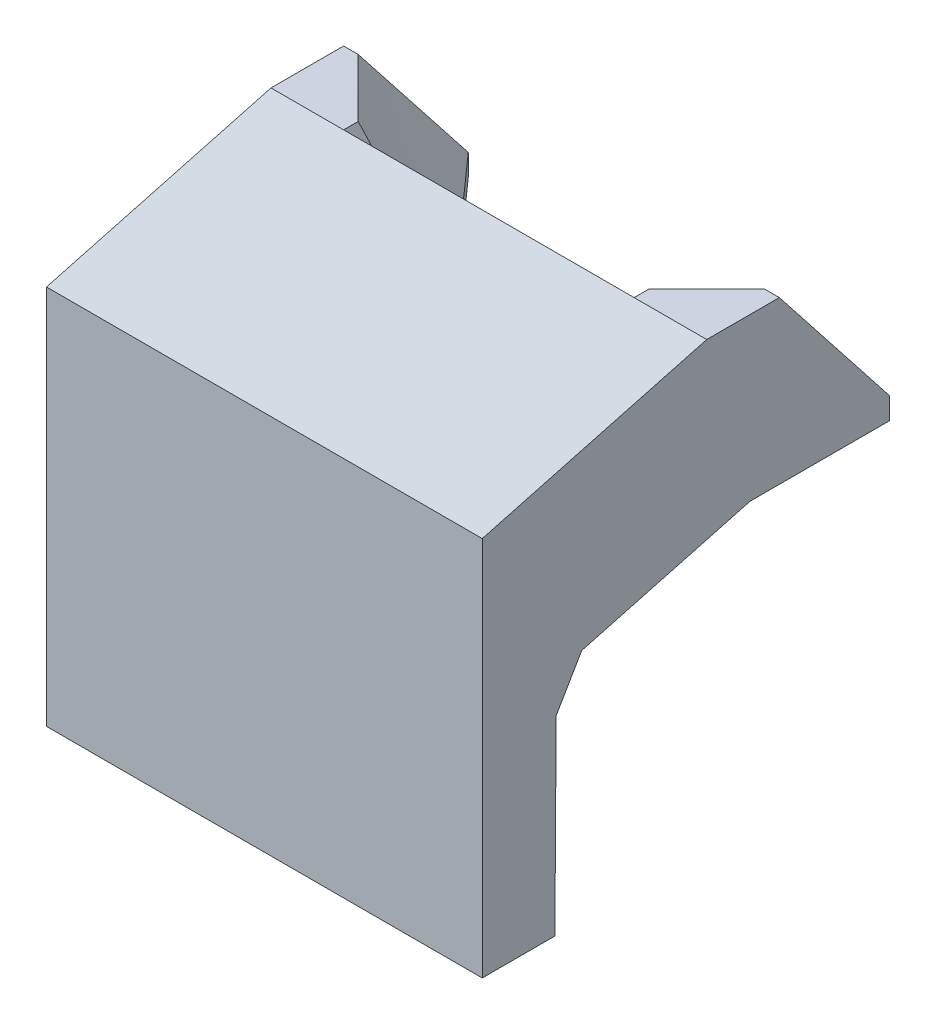
ISO-10303-21;
HEADER;
FILE_DESCRIPTION(('STEP AP214'),'2;1');
FILE_NAME('part.step','',(''),(''),'','','');
FILE_SCHEMA(('AUTOMOTIVE_DESIGN { 1 0 10303 214 1 1 1 1 }'));
ENDSEC;
DATA;
#1=APPLICATION_CONTEXT('core data for automotive mechanical design processes');
#2=APPLICATION_PROTOCOL_DEFINITION('international standard','automotive_design',2000,#1);
#3=PRODUCT_CONTEXT('',#1,'mechanical');
#4=PRODUCT('Part','Part','',(#3));
#5=PRODUCT_RELATED_PRODUCT_CATEGORY('part','',(#4));
#6=PRODUCT_DEFINITION_FORMATION('','',#4);
#7=PRODUCT_DEFINITION_CONTEXT('part definition',#1,'design');
#8=PRODUCT_DEFINITION('design','',#6,#7);
#9=PRODUCT_DEFINITION_SHAPE('','',#8);
#10=(LENGTH_UNIT() NAMED_UNIT(*) SI_UNIT(.MILLI.,.METRE.));
#11=(NAMED_UNIT(*) PLANE_ANGLE_UNIT() SI_UNIT($,.RADIAN.));
#12=(NAMED_UNIT(*) SI_UNIT($,.STERADIAN.) SOLID_ANGLE_UNIT());
#13=UNCERTAINTY_MEASURE_WITH_UNIT(LENGTH_MEASURE(1.E-05),#10,'distance_accuracy_value','');
#14=(GEOMETRIC_REPRESENTATION_CONTEXT(3) GLOBAL_UNCERTAINTY_ASSIGNED_CONTEXT((#13)) GLOBAL_UNIT_ASSIGNED_CONTEXT((#10,
#11,#12)) REPRESENTATION_CONTEXT('',''));
#15=CARTESIAN_POINT('',(0.,0.,0.));
#16=DIRECTION('',(0.,0.,1.));
#17=DIRECTION('',(1.,0.,0.));
#18=AXIS2_PLACEMENT_3D('',#15,#16,#17);
#19=CARTESIAN_POINT('',(762.,487.820479131947,-341.339964862952));
#20=DIRECTION('',(0.,-0.258819045102518,0.965925826289069));
#21=DIRECTION('',(0.,-0.965925826289069,-0.258819045102518));
#22=AXIS2_PLACEMENT_3D('',#19,#20,#21);
#23=PLANE('',#22);
#24=DIRECTION('',(0.,-0.965925826289069,-0.258819045102518));
#25=VECTOR('',#24,1.);
#26=CARTESIAN_POINT('',(228.6,487.820479131947,-341.339964862952));
#27=LINE('',#26,#25);
#28=CARTESIAN_POINT('',(228.6,525.920479131947,-331.131100631326));
#29=VERTEX_POINT('',#28);
#30=CARTESIAN_POINT('',(228.6,487.820479131947,-341.339964862952));
#31=VERTEX_POINT('',#30);
#32=EDGE_CURVE('E79',#29,#31,#27,.T.);
#33=ORIENTED_EDGE('',*,*,#32,.F.);
#34=DIRECTION('',(0.372177239238478,-0.896535336836941,-0.24022591949142));
#35=VECTOR('',#34,1.);
#36=CARTESIAN_POINT('',(127.,770.664059929663,-265.552255803878));
#37=LINE('',#36,#35);
#38=CARTESIAN_POINT('',(127.,770.664059929663,-265.552255803878));
#39=VERTEX_POINT('',#38);
#40=EDGE_CURVE('E891',#39,#29,#37,.T.);
#41=ORIENTED_EDGE('',*,*,#40,.F.);
#42=DIRECTION('',(-1.,0.,0.));
#43=VECTOR('',#42,1.);
#44=CARTESIAN_POINT('',(762.,770.664059929663,-265.552255803878));
#45=LINE('',#44,#43);
#46=CARTESIAN_POINT('',(635.,770.664059929663,-265.552255803878));
#47=VERTEX_POINT('',#46);
#48=EDGE_CURVE('E524',#47,#39,#45,.T.);
#49=ORIENTED_EDGE('',*,*,#48,.F.);
#50=DIRECTION('',(-0.372177239238478,-0.896535336836941,-0.24022591949142));
#51=VECTOR('',#50,1.);
#52=CARTESIAN_POINT('',(635.,770.664059929663,-265.552255803878));
#53=LINE('',#52,#51);
#54=CARTESIAN_POINT('',(533.4,525.920479131947,-331.131100631326));
#55=VERTEX_POINT('',#54);
#56=EDGE_CURVE('E577',#47,#55,#53,.T.);
#57=ORIENTED_EDGE('',*,*,#56,.T.);
#58=DIRECTION('',(0.,-0.965925826289069,-0.258819045102518));
#59=VECTOR('',#58,1.);
#60=CARTESIAN_POINT('',(533.4,487.820479131947,-341.339964862952));
#61=LINE('',#60,#59);
#62=CARTESIAN_POINT('',(533.4,487.820479131947,-341.339964862951));
#63=VERTEX_POINT('',#62);
#64=EDGE_CURVE('E523',#55,#63,#61,.T.);
#65=ORIENTED_EDGE('',*,*,#64,.T.);
#66=DIRECTION('',(-1.,0.,0.));
#67=VECTOR('',#66,1.);
#68=CARTESIAN_POINT('',(762.,487.820479131947,-341.339964862952));
#69=LINE('',#68,#67);
#70=EDGE_CURVE('E714',#63,#31,#69,.T.);
#71=ORIENTED_EDGE('',*,*,#70,.T.);
#72=EDGE_LOOP('',(#33,#41,#49,#57,#65,#71));
#73=FACE_BOUND('',#72,.T.);
#74=ADVANCED_FACE('F54',(#73),#23,.F.);
#75=CARTESIAN_POINT('',(762.,332.7324341847,-2.2438452541043));
#76=DIRECTION('',(0.,0.505828707352784,0.862633942537512));
#77=DIRECTION('',(0.,-0.862633942537512,0.505828707352784));
#78=AXIS2_PLACEMENT_3D('',#75,#76,#77);
#79=PLANE('',#78);
#80=DIRECTION('',(0.,0.862633942537512,-0.505828707352784));
#81=VECTOR('',#80,1.);
#82=CARTESIAN_POINT('',(0.,332.7324341847,-2.2438452541043));
#83=LINE('',#82,#81);
#84=CARTESIAN_POINT('',(0.,332.7324341847,-2.2438452541043));
#85=VERTEX_POINT('',#84);
#86=CARTESIAN_POINT('',(0.,408.9324341847,-46.9257730100435));
#87=VERTEX_POINT('',#86);
#88=EDGE_CURVE('E602',#85,#87,#83,.T.);
#89=ORIENTED_EDGE('',*,*,#88,.T.);
#90=DIRECTION('',(-1.,0.,0.));
#91=VECTOR('',#90,1.);
#92=CARTESIAN_POINT('',(762.,408.9324341847,-46.9257730100435));
#93=LINE('',#92,#91);
#94=CARTESIAN_POINT('',(762.,408.9324341847,-46.9257730100435));
#95=VERTEX_POINT('',#94);
#96=EDGE_CURVE('E12',#95,#87,#93,.T.);
#97=ORIENTED_EDGE('',*,*,#96,.F.);
#98=DIRECTION('',(0.,0.862633942537512,-0.505828707352784));
#99=VECTOR('',#98,1.);
#100=CARTESIAN_POINT('',(762.,332.7324341847,-2.2438452541043));
#101=LINE('',#100,#99);
#102=CARTESIAN_POINT('',(762.,332.7324341847,-2.2438452541043));
#103=VERTEX_POINT('',#102);
#104=EDGE_CURVE('E689',#103,#95,#101,.T.);
#105=ORIENTED_EDGE('',*,*,#104,.F.);
#106=DIRECTION('',(-1.,0.,0.));
#107=VECTOR('',#106,1.);
#108=CARTESIAN_POINT('',(762.,332.7324341847,-2.2438452541043));
#109=LINE('',#108,#107);
#110=EDGE_CURVE('E679',#103,#85,#109,.T.);
#111=ORIENTED_EDGE('',*,*,#110,.T.);
#112=EDGE_LOOP('',(#89,#97,#105,#111));
#113=FACE_BOUND('',#112,.T.);
#114=ADVANCED_FACE('F56',(#113),#79,.F.);
#115=CARTESIAN_POINT('',(762.,408.9324341847,-46.9257730100435));
#116=DIRECTION('',(0.,0.965925826289069,0.258819045102518));
#117=DIRECTION('',(0.,-0.258819045102518,0.965925826289069));
#118=AXIS2_PLACEMENT_3D('',#115,#116,#117);
#119=PLANE('',#118);
#120=DIRECTION('',(0.,0.258819045102518,-0.965925826289069));
#121=VECTOR('',#120,1.);
#122=CARTESIAN_POINT('',(0.,408.9324341847,-46.9257730100435));
#123=LINE('',#122,#121);
#124=CARTESIAN_POINT('',(0.,487.820479131947,-341.339964862952));
#125=VERTEX_POINT('',#124);
#126=EDGE_CURVE('E605',#87,#125,#123,.T.);
#127=ORIENTED_EDGE('',*,*,#126,.T.);
#128=DIRECTION('',(-1.,0.,0.));
#129=VECTOR('',#128,1.);
#130=CARTESIAN_POINT('',(762.,487.820479131947,-341.339964862951));
#131=LINE('',#130,#129);
#132=EDGE_CURVE('E72',#31,#125,#131,.T.);
#133=ORIENTED_EDGE('',*,*,#132,.F.);
#134=ORIENTED_EDGE('',*,*,#70,.F.);
#135=CARTESIAN_POINT('',(762.,487.820479131947,-341.339964862952));
#136=VERTEX_POINT('',#135);
#137=EDGE_CURVE('E64',#136,#63,#69,.T.);
#138=ORIENTED_EDGE('',*,*,#137,.F.);
#139=DIRECTION('',(0.,0.258819045102518,-0.965925826289069));
#140=VECTOR('',#139,1.);
#141=CARTESIAN_POINT('',(762.,408.9324341847,-46.9257730100435));
#142=LINE('',#141,#140);
#143=EDGE_CURVE('E519',#95,#136,#142,.T.);
#144=ORIENTED_EDGE('',*,*,#143,.F.);
#145=ORIENTED_EDGE('',*,*,#96,.T.);
#146=EDGE_LOOP('',(#127,#133,#134,#138,#144,#145));
#147=FACE_BOUND('',#146,.T.);
#148=ADVANCED_FACE('F320',(#147),#119,.F.);
#149=CARTESIAN_POINT('',(762.,770.664059929663,-265.552255803878));
#150=DIRECTION('',(0.,-0.965925826289069,-0.258819045102518));
#151=DIRECTION('',(0.,0.258819045102518,-0.965925826289069));
#152=AXIS2_PLACEMENT_3D('',#149,#150,#151);
#153=PLANE('',#152);
#154=DIRECTION('',(0.,-0.258819045102518,0.965925826289069));
#155=VECTOR('',#154,1.);
#156=CARTESIAN_POINT('',(0.,770.664059929663,-265.552255803878));
#157=LINE('',#156,#155);
#158=CARTESIAN_POINT('',(0.,770.664059929663,-265.552255803878));
#159=VERTEX_POINT('',#158);
#160=CARTESIAN_POINT('',(0.,665.48,127.));
#161=VERTEX_POINT('',#160);
#162=EDGE_CURVE('E614',#159,#161,#157,.T.);
#163=ORIENTED_EDGE('',*,*,#162,.T.);
#164=DIRECTION('',(-1.,0.,0.));
#165=VECTOR('',#164,1.);
#166=CARTESIAN_POINT('',(762.,665.48,127.));
#167=LINE('',#166,#165);
#168=CARTESIAN_POINT('',(762.,665.48,127.));
#169=VERTEX_POINT('',#168);
#170=EDGE_CURVE('E710',#169,#161,#167,.T.);
#171=ORIENTED_EDGE('',*,*,#170,.F.);
#172=DIRECTION('',(0.,-0.258819045102518,0.965925826289069));
#173=VECTOR('',#172,1.);
#174=CARTESIAN_POINT('',(762.,770.664059929663,-265.552255803878));
#175=LINE('',#174,#173);
#176=CARTESIAN_POINT('',(762.,770.664059929663,-265.552255803878));
#177=VERTEX_POINT('',#176);
#178=EDGE_CURVE('E516',#177,#169,#175,.T.);
#179=ORIENTED_EDGE('',*,*,#178,.F.);
#180=CARTESIAN_POINT('',(762.,770.664059929663,-265.552255803878));
#181=DIRECTION('',(-1.,0.,0.));
#182=VECTOR('',#181,1.);
#183=LINE('',#180,#182);
#184=EDGE_CURVE('E716',#177,#47,#183,.T.);
#185=ORIENTED_EDGE('',*,*,#184,.T.);
#186=ORIENTED_EDGE('',*,*,#48,.T.);
#187=DIRECTION('',(-1.,0.,0.));
#188=VECTOR('',#187,1.);
#189=CARTESIAN_POINT('',(127.,770.664059929663,-265.552255803878));
#190=LINE('',#189,#188);
#191=EDGE_CURVE('E218',#39,#159,#190,.T.);
#192=ORIENTED_EDGE('',*,*,#191,.T.);
#193=EDGE_LOOP('',(#163,#171,#179,#185,#186,#192));
#194=FACE_BOUND('',#193,.T.);
#195=ADVANCED_FACE('F309',(#194),#153,.F.);
#196=CARTESIAN_POINT('',(762.,665.48,127.));
#197=DIRECTION('',(0.,0.,-1.));
#198=DIRECTION('',(-1.,0.,0.));
#199=AXIS2_PLACEMENT_3D('',#196,#197,#198);
#200=PLANE('',#199);
#201=DIRECTION('',(0.,-1.,0.));
#202=VECTOR('',#201,1.);
#203=CARTESIAN_POINT('',(0.,665.48,127.));
#204=LINE('',#203,#202);
#205=CARTESIAN_POINT('',(0.,0.,127.));
#206=VERTEX_POINT('',#205);
#207=EDGE_CURVE('E700',#161,#206,#204,.T.);
#208=ORIENTED_EDGE('',*,*,#207,.T.);
#209=DIRECTION('',(-1.,0.,0.));
#210=VECTOR('',#209,1.);
#211=CARTESIAN_POINT('',(762.,0.,127.));
#212=LINE('',#211,#210);
#213=CARTESIAN_POINT('',(762.,0.,127.));
#214=VERTEX_POINT('',#213);
#215=EDGE_CURVE('E707',#214,#206,#212,.T.);
#216=ORIENTED_EDGE('',*,*,#215,.F.);
#217=DIRECTION('',(0.,-1.,0.));
#218=VECTOR('',#217,1.);
#219=CARTESIAN_POINT('',(762.,665.48,127.));
#220=LINE('',#219,#218);
#221=EDGE_CURVE('E518',#169,#214,#220,.T.);
#222=ORIENTED_EDGE('',*,*,#221,.F.);
#223=ORIENTED_EDGE('',*,*,#170,.T.);
#224=EDGE_LOOP('',(#208,#216,#222,#223));
#225=FACE_BOUND('',#224,.T.);
#226=ADVANCED_FACE('F319',(#225),#200,.F.);
#227=CARTESIAN_POINT('',(762.,0.,127.));
#228=DIRECTION('',(0.,1.,0.));
#229=DIRECTION('',(0.,0.,1.));
#230=AXIS2_PLACEMENT_3D('',#227,#228,#229);
#231=PLANE('',#230);
#232=DIRECTION('',(0.,0.,-1.));
#233=VECTOR('',#232,1.);
#234=CARTESIAN_POINT('',(0.,0.,127.));
#235=LINE('',#234,#233);
#236=CARTESIAN_POINT('',(0.,0.,0.));
#237=VERTEX_POINT('',#236);
#238=EDGE_CURVE('E693',#206,#237,#235,.T.);
#239=ORIENTED_EDGE('',*,*,#238,.T.);
#240=DIRECTION('',(-1.,0.,0.));
#241=VECTOR('',#240,1.);
#242=CARTESIAN_POINT('',(762.,0.,0.));
#243=LINE('',#242,#241);
#244=CARTESIAN_POINT('',(762.,0.,0.));
#245=VERTEX_POINT('',#244);
#246=EDGE_CURVE('E704',#245,#237,#243,.T.);
#247=ORIENTED_EDGE('',*,*,#246,.F.);
#248=DIRECTION('',(0.,0.,-1.));
#249=VECTOR('',#248,1.);
#250=CARTESIAN_POINT('',(762.,0.,127.));
#251=LINE('',#250,#249);
#252=EDGE_CURVE('E697',#214,#245,#251,.T.);
#253=ORIENTED_EDGE('',*,*,#252,.F.);
#254=ORIENTED_EDGE('',*,*,#215,.T.);
#255=EDGE_LOOP('',(#239,#247,#253,#254));
#256=FACE_BOUND('',#255,.T.);
#257=ADVANCED_FACE('F724',(#256),#231,.F.);
#258=CARTESIAN_POINT('',(762.,0.,0.));
#259=DIRECTION('',(0.,0.00674353926219962,0.999977262080603));
#260=DIRECTION('',(0.,-0.999977262080603,0.00674353926219962));
#261=AXIS2_PLACEMENT_3D('',#258,#259,#260);
#262=PLANE('',#261);
#263=DIRECTION('',(0.,0.999977262080603,-0.00674353926219962));
#264=VECTOR('',#263,1.);
#265=CARTESIAN_POINT('',(0.,0.,0.));
#266=LINE('',#265,#264);
#267=EDGE_CURVE('E683',#237,#85,#266,.T.);
#268=ORIENTED_EDGE('',*,*,#267,.T.);
#269=ORIENTED_EDGE('',*,*,#110,.F.);
#270=DIRECTION('',(0.,0.999977262080603,-0.00674353926219962));
#271=VECTOR('',#270,1.);
#272=CARTESIAN_POINT('',(762.,0.,0.));
#273=LINE('',#272,#271);
#274=EDGE_CURVE('E692',#245,#103,#273,.T.);
#275=ORIENTED_EDGE('',*,*,#274,.F.);
#276=ORIENTED_EDGE('',*,*,#246,.T.);
#277=EDGE_LOOP('',(#268,#269,#275,#276));
#278=FACE_BOUND('',#277,.T.);
#279=ADVANCED_FACE('F359',(#278),#262,.F.);
#280=CARTESIAN_POINT('',(762.,0.,0.));
#281=DIRECTION('',(-1.,0.,0.));
#282=DIRECTION('',(0.,0.,1.));
#283=AXIS2_PLACEMENT_3D('',#280,#281,#282);
#284=PLANE('',#283);
#285=ORIENTED_EDGE('',*,*,#143,.T.);
#286=DIRECTION('',(0.,0.,-1.));
#287=VECTOR('',#286,1.);
#288=CARTESIAN_POINT('',(762.,487.820479131947,-331.131100631326));
#289=LINE('',#288,#287);
#290=CARTESIAN_POINT('',(762.,487.820479131947,-585.131100631326));
#291=VERTEX_POINT('',#290);
#292=EDGE_CURVE('E429',#136,#291,#289,.T.);
#293=ORIENTED_EDGE('',*,*,#292,.T.);
#294=DIRECTION('',(0.,1.,0.));
#295=VECTOR('',#294,1.);
#296=CARTESIAN_POINT('',(762.,487.820479131947,-585.131100631326));
#297=LINE('',#296,#295);
#298=CARTESIAN_POINT('',(762.,525.920479131947,-585.131100631326));
#299=VERTEX_POINT('',#298);
#300=EDGE_CURVE('E440',#291,#299,#297,.T.);
#301=ORIENTED_EDGE('',*,*,#300,.T.);
#302=DIRECTION('',(0.,-0.785880865119772,-0.618377931235097));
#303=VECTOR('',#302,1.);
#304=CARTESIAN_POINT('',(762.,770.664059929663,-392.552255803878));
#305=LINE('',#304,#303);
#306=CARTESIAN_POINT('',(762.,770.664059929663,-392.552255803878));
#307=VERTEX_POINT('',#306);
#308=EDGE_CURVE('E512',#307,#299,#305,.T.);
#309=ORIENTED_EDGE('',*,*,#308,.F.);
#310=DIRECTION('',(0.,0.,-1.));
#311=VECTOR('',#310,1.);
#312=CARTESIAN_POINT('',(762.,770.664059929663,-265.552255803878));
#313=LINE('',#312,#311);
#314=EDGE_CURVE('E340',#177,#307,#313,.T.);
#315=ORIENTED_EDGE('',*,*,#314,.F.);
#316=ORIENTED_EDGE('',*,*,#178,.T.);
#317=ORIENTED_EDGE('',*,*,#221,.T.);
#318=ORIENTED_EDGE('',*,*,#252,.T.);
#319=ORIENTED_EDGE('',*,*,#274,.T.);
#320=ORIENTED_EDGE('',*,*,#104,.T.);
#321=EDGE_LOOP('',(#285,#293,#301,#309,#315,#316,#317,#318,#319,#320));
#322=FACE_BOUND('',#321,.T.);
#323=ADVANCED_FACE('F348',(#322),#284,.F.);
#324=CARTESIAN_POINT('',(0.,0.,0.));
#325=DIRECTION('',(-1.,0.,0.));
#326=DIRECTION('',(0.,0.,1.));
#327=AXIS2_PLACEMENT_3D('',#324,#325,#326);
#328=PLANE('',#327);
#329=DIRECTION('',(0.,0.,-1.));
#330=VECTOR('',#329,1.);
#331=CARTESIAN_POINT('',(0.,487.820479131947,-331.131100631326));
#332=LINE('',#331,#330);
#333=CARTESIAN_POINT('',(0.,487.820479131947,-585.131100631326));
#334=VERTEX_POINT('',#333);
#335=EDGE_CURVE('E210',#125,#334,#332,.T.);
#336=ORIENTED_EDGE('',*,*,#335,.F.);
#337=ORIENTED_EDGE('',*,*,#126,.F.);
#338=ORIENTED_EDGE('',*,*,#88,.F.);
#339=ORIENTED_EDGE('',*,*,#267,.F.);
#340=ORIENTED_EDGE('',*,*,#238,.F.);
#341=ORIENTED_EDGE('',*,*,#207,.F.);
#342=ORIENTED_EDGE('',*,*,#162,.F.);
#343=DIRECTION('',(0.,0.,-1.));
#344=VECTOR('',#343,1.);
#345=CARTESIAN_POINT('',(0.,770.664059929663,-265.552255803878));
#346=LINE('',#345,#344);
#347=CARTESIAN_POINT('',(0.,770.664059929663,-392.552255803878));
#348=VERTEX_POINT('',#347);
#349=EDGE_CURVE('E295',#159,#348,#346,.T.);
#350=ORIENTED_EDGE('',*,*,#349,.T.);
#351=DIRECTION('',(0.,-0.785880865119772,-0.618377931235097));
#352=VECTOR('',#351,1.);
#353=CARTESIAN_POINT('',(0.,770.664059929663,-392.552255803878));
#354=LINE('',#353,#352);
#355=CARTESIAN_POINT('',(0.,525.920479131947,-585.131100631326));
#356=VERTEX_POINT('',#355);
#357=EDGE_CURVE('E293',#348,#356,#354,.T.);
#358=ORIENTED_EDGE('',*,*,#357,.T.);
#359=DIRECTION('',(0.,1.,0.));
#360=VECTOR('',#359,1.);
#361=CARTESIAN_POINT('',(0.,487.820479131947,-585.131100631326));
#362=LINE('',#361,#360);
#363=EDGE_CURVE('E416',#334,#356,#362,.T.);
#364=ORIENTED_EDGE('',*,*,#363,.F.);
#365=EDGE_LOOP('',(#336,#337,#338,#339,#340,#341,#342,#350,#358,#364));
#366=FACE_BOUND('',#365,.T.);
#367=ADVANCED_FACE('F358',(#366),#328,.T.);
#368=CARTESIAN_POINT('',(0.,770.664059929663,0.));
#369=DIRECTION('',(0.,1.,0.));
#370=DIRECTION('',(0.,0.,1.));
#371=AXIS2_PLACEMENT_3D('',#368,#369,#370);
#372=PLANE('',#371);
#373=ORIENTED_EDGE('',*,*,#184,.F.);
#374=ORIENTED_EDGE('',*,*,#314,.T.);
#375=DIRECTION('',(-1.,0.,0.));
#376=VECTOR('',#375,1.);
#377=CARTESIAN_POINT('',(762.,770.664059929663,-392.552255803878));
#378=LINE('',#377,#376);
#379=CARTESIAN_POINT('',(736.6,770.664059929663,-392.552255803878));
#380=VERTEX_POINT('',#379);
#381=EDGE_CURVE('E522',#307,#380,#378,.T.);
#382=ORIENTED_EDGE('',*,*,#381,.T.);
#383=DIRECTION('',(-0.707106781186547,0.,0.707106781186547));
#384=VECTOR('',#383,1.);
#385=CARTESIAN_POINT('',(736.6,770.664059929663,-392.552255803878));
#386=LINE('',#385,#384);
#387=CARTESIAN_POINT('',(635.,770.664059929663,-290.952255803878));
#388=VERTEX_POINT('',#387);
#389=EDGE_CURVE('E513',#380,#388,#386,.T.);
#390=ORIENTED_EDGE('',*,*,#389,.T.);
#391=DIRECTION('',(0.,0.,1.));
#392=VECTOR('',#391,1.);
#393=CARTESIAN_POINT('',(635.,770.664059929663,-290.952255803878));
#394=LINE('',#393,#392);
#395=EDGE_CURVE('E446',#388,#47,#394,.T.);
#396=ORIENTED_EDGE('',*,*,#395,.T.);
#397=EDGE_LOOP('',(#373,#374,#382,#390,#396));
#398=FACE_BOUND('',#397,.T.);
#399=ADVANCED_FACE('F368',(#398),#372,.T.);
#400=CARTESIAN_POINT('',(2.69672465141973E-12,485.46436828936,-616.964381270939));
#401=DIRECTION('',(0.,0.618377931235097,-0.785880865119772));
#402=DIRECTION('',(0.,0.785880865119772,0.618377931235097));
#403=AXIS2_PLACEMENT_3D('',#400,#401,#402);
#404=PLANE('',#403);
#405=ORIENTED_EDGE('',*,*,#308,.T.);
#406=DIRECTION('',(-1.,0.,0.));
#407=VECTOR('',#406,1.);
#408=CARTESIAN_POINT('',(762.,525.920479131947,-585.131100631326));
#409=LINE('',#408,#407);
#410=CARTESIAN_POINT('',(736.6,525.920479131947,-585.131100631326));
#411=VERTEX_POINT('',#410);
#412=EDGE_CURVE('E498',#299,#411,#409,.T.);
#413=ORIENTED_EDGE('',*,*,#412,.T.);
#414=DIRECTION('',(0.,-0.785880865119772,-0.618377931235098));
#415=VECTOR('',#414,1.);
#416=CARTESIAN_POINT('',(736.6,648.292269530805,-488.841678217602));
#417=LINE('',#416,#415);
#418=EDGE_CURVE('E571',#380,#411,#417,.T.);
#419=ORIENTED_EDGE('',*,*,#418,.F.);
#420=ORIENTED_EDGE('',*,*,#381,.F.);
#421=EDGE_LOOP('',(#405,#413,#419,#420));
#422=FACE_BOUND('',#421,.T.);
#423=ADVANCED_FACE('F462',(#422),#404,.T.);
#424=CARTESIAN_POINT('',(268.759717863551,-111.569779464433,0.));
#425=DIRECTION('',(-0.923580539340854,0.383404469654252,0.));
#426=DIRECTION('',(-0.383404469654252,-0.923580539340854,0.));
#427=AXIS2_PLACEMENT_3D('',#424,#425,#426);
#428=PLANE('',#427);
#429=DIRECTION('',(-0.372177239238478,-0.896535336836941,-0.24022591949142));
#430=VECTOR('',#429,1.);
#431=CARTESIAN_POINT('',(635.,770.664059929663,-290.952255803878));
#432=LINE('',#431,#430);
#433=CARTESIAN_POINT('',(533.4,525.920479131947,-356.531100631326));
#434=VERTEX_POINT('',#433);
#435=EDGE_CURVE('E451',#388,#434,#432,.T.);
#436=ORIENTED_EDGE('',*,*,#435,.T.);
#437=DIRECTION('',(0.,0.,1.));
#438=VECTOR('',#437,1.);
#439=CARTESIAN_POINT('',(533.4,525.920479131947,-356.531100631326));
#440=LINE('',#439,#438);
#441=EDGE_CURVE('E598',#434,#55,#440,.T.);
#442=ORIENTED_EDGE('',*,*,#441,.T.);
#443=ORIENTED_EDGE('',*,*,#56,.F.);
#444=ORIENTED_EDGE('',*,*,#395,.F.);
#445=EDGE_LOOP('',(#436,#442,#443,#444));
#446=FACE_BOUND('',#445,.T.);
#447=ADVANCED_FACE('F453',(#446),#428,.T.);
#448=CARTESIAN_POINT('',(635.,770.664059929663,-290.952255803878));
#449=CARTESIAN_POINT('',(533.4,525.920479131947,-356.531100631326));
#450=CARTESIAN_POINT('',(651.933333333333,770.664059929663,-307.885589137211));
#451=CARTESIAN_POINT('',(567.266666666666,525.920479131947,-394.631100631326));
#452=CARTESIAN_POINT('',(668.866666666666,770.664059929663,-324.818922470544));
#453=CARTESIAN_POINT('',(601.133333333333,525.920479131947,-432.731100631325));
#454=CARTESIAN_POINT('',(702.733333333333,770.664059929663,-358.685589137211));
#455=CARTESIAN_POINT('',(668.866666666666,525.920479131947,-508.931100631326));
#456=CARTESIAN_POINT('',(719.666666666666,770.664059929663,-375.618922470544));
#457=CARTESIAN_POINT('',(702.733333333333,525.920479131947,-547.031100631326));
#458=CARTESIAN_POINT('',(736.6,770.664059929663,-392.552255803878));
#459=CARTESIAN_POINT('',(736.6,525.920479131947,-585.131100631326));
#460=B_SPLINE_SURFACE_WITH_KNOTS('',3,1,((#448,#449),(#450,#451),(#452,#453),(#454,#455),(#456,
#457),(#458,#459)),.UNSPECIFIED.,.F.,.F.,.F.,(4,2,4),(2,2),(0.,0.5,1.),(0.,1.),.UNSPECIFIED.);
#461=DIRECTION('',(-0.66436383882992,0.,0.74740931868366));
#462=VECTOR('',#461,1.);
#463=CARTESIAN_POINT('',(736.6,525.920479131947,-585.131100631326));
#464=LINE('',#463,#462);
#465=EDGE_CURVE('E483',#411,#434,#464,.T.);
#466=ORIENTED_EDGE('',*,*,#389,.F.);
#467=ORIENTED_EDGE('',*,*,#418,.T.);
#468=ORIENTED_EDGE('',*,*,#465,.T.);
#469=ORIENTED_EDGE('',*,*,#435,.F.);
#470=EDGE_LOOP('',(#466,#467,#468,#469));
#471=FACE_BOUND('',#470,.T.);
#472=ADVANCED_FACE('F360',(#471),#460,.T.);
#473=CARTESIAN_POINT('',(0.,487.820479131947,0.));
#474=DIRECTION('',(0.,1.,0.));
#475=DIRECTION('',(0.,0.,1.));
#476=AXIS2_PLACEMENT_3D('',#473,#474,#475);
#477=PLANE('',#476);
#478=ORIENTED_EDGE('',*,*,#292,.F.);
#479=ORIENTED_EDGE('',*,*,#137,.T.);
#480=DIRECTION('',(0.,0.,1.));
#481=VECTOR('',#480,1.);
#482=CARTESIAN_POINT('',(533.4,487.820479131947,-356.531100631326));
#483=LINE('',#482,#481);
#484=CARTESIAN_POINT('',(533.4,487.820479131947,-356.531100631326));
#485=VERTEX_POINT('',#484);
#486=EDGE_CURVE('E437',#485,#63,#483,.T.);
#487=ORIENTED_EDGE('',*,*,#486,.F.);
#488=DIRECTION('',(-0.66436383882992,0.,0.74740931868366));
#489=VECTOR('',#488,1.);
#490=CARTESIAN_POINT('',(736.6,487.820479131947,-585.131100631326));
#491=LINE('',#490,#489);
#492=CARTESIAN_POINT('',(736.6,487.820479131947,-585.131100631326));
#493=VERTEX_POINT('',#492);
#494=EDGE_CURVE('E434',#493,#485,#491,.T.);
#495=ORIENTED_EDGE('',*,*,#494,.F.);
#496=DIRECTION('',(-1.,0.,0.));
#497=VECTOR('',#496,1.);
#498=CARTESIAN_POINT('',(762.,487.820479131947,-585.131100631326));
#499=LINE('',#498,#497);
#500=EDGE_CURVE('E431',#291,#493,#499,.T.);
#501=ORIENTED_EDGE('',*,*,#500,.F.);
#502=EDGE_LOOP('',(#478,#479,#487,#495,#501));
#503=FACE_BOUND('',#502,.T.);
#504=ADVANCED_FACE('F660',(#503),#477,.F.);
#505=CARTESIAN_POINT('',(533.4,487.820479131947,-356.531100631326));
#506=DIRECTION('',(-1.,0.,0.));
#507=DIRECTION('',(0.,0.,1.));
#508=AXIS2_PLACEMENT_3D('',#505,#506,#507);
#509=PLANE('',#508);
#510=ORIENTED_EDGE('',*,*,#64,.F.);
#511=ORIENTED_EDGE('',*,*,#441,.F.);
#512=DIRECTION('',(0.,1.,0.));
#513=VECTOR('',#512,1.);
#514=CARTESIAN_POINT('',(533.4,487.820479131947,-356.531100631326));
#515=LINE('',#514,#513);
#516=EDGE_CURVE('E346',#485,#434,#515,.T.);
#517=ORIENTED_EDGE('',*,*,#516,.F.);
#518=ORIENTED_EDGE('',*,*,#486,.T.);
#519=EDGE_LOOP('',(#510,#511,#517,#518));
#520=FACE_BOUND('',#519,.T.);
#521=ADVANCED_FACE('F657',(#520),#509,.T.);
#522=CARTESIAN_POINT('',(736.6,487.820479131947,-585.131100631326));
#523=DIRECTION('',(-0.74740931868366,0.,-0.66436383882992));
#524=DIRECTION('',(-0.66436383882992,0.,0.74740931868366));
#525=AXIS2_PLACEMENT_3D('',#522,#523,#524);
#526=PLANE('',#525);
#527=ORIENTED_EDGE('',*,*,#465,.F.);
#528=DIRECTION('',(0.,1.,0.));
#529=VECTOR('',#528,1.);
#530=CARTESIAN_POINT('',(736.6,487.820479131947,-585.131100631326));
#531=LINE('',#530,#529);
#532=EDGE_CURVE('E639',#493,#411,#531,.T.);
#533=ORIENTED_EDGE('',*,*,#532,.F.);
#534=ORIENTED_EDGE('',*,*,#494,.T.);
#535=ORIENTED_EDGE('',*,*,#516,.T.);
#536=EDGE_LOOP('',(#527,#533,#534,#535));
#537=FACE_BOUND('',#536,.T.);
#538=ADVANCED_FACE('F649',(#537),#526,.T.);
#539=CARTESIAN_POINT('',(762.,487.820479131947,-585.131100631326));
#540=DIRECTION('',(0.,0.,-1.));
#541=DIRECTION('',(-1.,0.,0.));
#542=AXIS2_PLACEMENT_3D('',#539,#540,#541);
#543=PLANE('',#542);
#544=ORIENTED_EDGE('',*,*,#412,.F.);
#545=ORIENTED_EDGE('',*,*,#300,.F.);
#546=ORIENTED_EDGE('',*,*,#500,.T.);
#547=ORIENTED_EDGE('',*,*,#532,.T.);
#548=EDGE_LOOP('',(#544,#545,#546,#547));
#549=FACE_BOUND('',#548,.T.);
#550=ADVANCED_FACE('F546',(#549),#543,.T.);
#551=CARTESIAN_POINT('',(762.,770.664059929663,0.));
#552=DIRECTION('',(0.,1.,0.));
#553=DIRECTION('',(0.,0.,1.));
#554=AXIS2_PLACEMENT_3D('',#551,#552,#553);
#555=PLANE('',#554);
#556=ORIENTED_EDGE('',*,*,#191,.F.);
#557=DIRECTION('',(0.,0.,1.));
#558=VECTOR('',#557,1.);
#559=CARTESIAN_POINT('',(127.,770.664059929663,-290.952255803878));
#560=LINE('',#559,#558);
#561=CARTESIAN_POINT('',(127.,770.664059929663,-290.952255803878));
#562=VERTEX_POINT('',#561);
#563=EDGE_CURVE('E223',#562,#39,#560,.T.);
#564=ORIENTED_EDGE('',*,*,#563,.F.);
#565=DIRECTION('',(0.707106781186547,0.,0.707106781186547));
#566=VECTOR('',#565,1.);
#567=CARTESIAN_POINT('',(25.4,770.664059929663,-392.552255803878));
#568=LINE('',#567,#566);
#569=CARTESIAN_POINT('',(25.4,770.664059929663,-392.552255803878));
#570=VERTEX_POINT('',#569);
#571=EDGE_CURVE('E294',#570,#562,#568,.T.);
#572=ORIENTED_EDGE('',*,*,#571,.F.);
#573=DIRECTION('',(1.,0.,0.));
#574=VECTOR('',#573,1.);
#575=CARTESIAN_POINT('',(0.,770.664059929663,-392.552255803878));
#576=LINE('',#575,#574);
#577=EDGE_CURVE('E905',#348,#570,#576,.T.);
#578=ORIENTED_EDGE('',*,*,#577,.F.);
#579=ORIENTED_EDGE('',*,*,#349,.F.);
#580=EDGE_LOOP('',(#556,#564,#572,#578,#579));
#581=FACE_BOUND('',#580,.T.);
#582=ADVANCED_FACE('F402',(#581),#555,.T.);
#583=CARTESIAN_POINT('',(761.999999999997,485.46436828936,-616.964381270939));
#584=DIRECTION('',(0.,0.618377931235097,-0.785880865119772));
#585=DIRECTION('',(0.,0.785880865119772,0.618377931235097));
#586=AXIS2_PLACEMENT_3D('',#583,#584,#585);
#587=PLANE('',#586);
#588=ORIENTED_EDGE('',*,*,#357,.F.);
#589=ORIENTED_EDGE('',*,*,#577,.T.);
#590=DIRECTION('',(0.,-0.785880865119772,-0.618377931235098));
#591=VECTOR('',#590,1.);
#592=CARTESIAN_POINT('',(25.4,648.292269530805,-488.841678217602));
#593=LINE('',#592,#591);
#594=CARTESIAN_POINT('',(25.4,525.920479131947,-585.131100631326));
#595=VERTEX_POINT('',#594);
#596=EDGE_CURVE('E422',#570,#595,#593,.T.);
#597=ORIENTED_EDGE('',*,*,#596,.T.);
#598=DIRECTION('',(1.,0.,0.));
#599=VECTOR('',#598,1.);
#600=CARTESIAN_POINT('',(0.,525.920479131947,-585.131100631326));
#601=LINE('',#600,#599);
#602=EDGE_CURVE('E276',#356,#595,#601,.T.);
#603=ORIENTED_EDGE('',*,*,#602,.F.);
#604=EDGE_LOOP('',(#588,#589,#597,#603));
#605=FACE_BOUND('',#604,.T.);
#606=ADVANCED_FACE('F242',(#605),#587,.T.);
#607=CARTESIAN_POINT('',(493.240282136449,-111.569779464433,0.));
#608=DIRECTION('',(0.923580539340854,0.383404469654252,0.));
#609=DIRECTION('',(0.383404469654252,-0.923580539340854,0.));
#610=AXIS2_PLACEMENT_3D('',#607,#608,#609);
#611=PLANE('',#610);
#612=DIRECTION('',(0.372177239238478,-0.896535336836941,-0.24022591949142));
#613=VECTOR('',#612,1.);
#614=CARTESIAN_POINT('',(127.,770.664059929663,-290.952255803878));
#615=LINE('',#614,#613);
#616=CARTESIAN_POINT('',(228.6,525.920479131947,-356.531100631326));
#617=VERTEX_POINT('',#616);
#618=EDGE_CURVE('E229',#562,#617,#615,.T.);
#619=ORIENTED_EDGE('',*,*,#618,.F.);
#620=ORIENTED_EDGE('',*,*,#563,.T.);
#621=ORIENTED_EDGE('',*,*,#40,.T.);
#622=DIRECTION('',(0.,0.,1.));
#623=VECTOR('',#622,1.);
#624=CARTESIAN_POINT('',(228.6,525.920479131947,-356.531100631326));
#625=LINE('',#624,#623);
#626=EDGE_CURVE('E58',#617,#29,#625,.T.);
#627=ORIENTED_EDGE('',*,*,#626,.F.);
#628=EDGE_LOOP('',(#619,#620,#621,#627));
#629=FACE_BOUND('',#628,.T.);
#630=ADVANCED_FACE('F231',(#629),#611,.T.);
#631=CARTESIAN_POINT('',(127.,770.664059929663,-290.952255803878));
#632=CARTESIAN_POINT('',(228.6,525.920479131947,-356.531100631326));
#633=CARTESIAN_POINT('',(110.066666666667,770.664059929663,-307.885589137211));
#634=CARTESIAN_POINT('',(194.733333333334,525.920479131947,-394.631100631326));
#635=CARTESIAN_POINT('',(93.1333333333336,770.664059929663,-324.818922470544));
#636=CARTESIAN_POINT('',(160.866666666667,525.920479131947,-432.731100631325));
#637=CARTESIAN_POINT('',(59.2666666666669,770.664059929663,-358.685589137211));
#638=CARTESIAN_POINT('',(93.1333333333339,525.920479131947,-508.931100631326));
#639=CARTESIAN_POINT('',(42.3333333333336,770.664059929663,-375.618922470544));
#640=CARTESIAN_POINT('',(59.266666666667,525.920479131947,-547.031100631326));
#641=CARTESIAN_POINT('',(25.4,770.664059929663,-392.552255803878));
#642=CARTESIAN_POINT('',(25.4,525.920479131947,-585.131100631326));
#643=B_SPLINE_SURFACE_WITH_KNOTS('',3,1,((#631,#632),(#633,#634),(#635,#636),(#637,#638),(#639,
#640),(#641,#642)),.UNSPECIFIED.,.F.,.F.,.F.,(4,2,4),(2,2),(0.,0.5,1.),(0.,1.),.UNSPECIFIED.);
#644=DIRECTION('',(0.66436383882992,0.,0.74740931868366));
#645=VECTOR('',#644,1.);
#646=CARTESIAN_POINT('',(25.4,525.920479131947,-585.131100631326));
#647=LINE('',#646,#645);
#648=EDGE_CURVE('E205',#595,#617,#647,.T.);
#649=ORIENTED_EDGE('',*,*,#571,.T.);
#650=ORIENTED_EDGE('',*,*,#618,.T.);
#651=ORIENTED_EDGE('',*,*,#648,.F.);
#652=ORIENTED_EDGE('',*,*,#596,.F.);
#653=EDGE_LOOP('',(#649,#650,#651,#652));
#654=FACE_BOUND('',#653,.T.);
#655=ADVANCED_FACE('F241',(#654),#643,.F.);
#656=CARTESIAN_POINT('',(762.,487.820479131947,0.));
#657=DIRECTION('',(0.,1.,0.));
#658=DIRECTION('',(0.,0.,1.));
#659=AXIS2_PLACEMENT_3D('',#656,#657,#658);
#660=PLANE('',#659);
#661=DIRECTION('',(0.,0.,1.));
#662=VECTOR('',#661,1.);
#663=CARTESIAN_POINT('',(228.6,487.820479131947,-356.531100631326));
#664=LINE('',#663,#662);
#665=CARTESIAN_POINT('',(228.6,487.820479131947,-356.531100631326));
#666=VERTEX_POINT('',#665);
#667=EDGE_CURVE('E193',#666,#31,#664,.T.);
#668=ORIENTED_EDGE('',*,*,#667,.T.);
#669=ORIENTED_EDGE('',*,*,#132,.T.);
#670=ORIENTED_EDGE('',*,*,#335,.T.);
#671=DIRECTION('',(1.,0.,0.));
#672=VECTOR('',#671,1.);
#673=CARTESIAN_POINT('',(0.,487.820479131947,-585.131100631326));
#674=LINE('',#673,#672);
#675=CARTESIAN_POINT('',(25.4,487.820479131947,-585.131100631326));
#676=VERTEX_POINT('',#675);
#677=EDGE_CURVE('E195',#334,#676,#674,.T.);
#678=ORIENTED_EDGE('',*,*,#677,.T.);
#679=DIRECTION('',(0.66436383882992,0.,0.74740931868366));
#680=VECTOR('',#679,1.);
#681=CARTESIAN_POINT('',(25.4,487.820479131947,-585.131100631326));
#682=LINE('',#681,#680);
#683=EDGE_CURVE('E189',#676,#666,#682,.T.);
#684=ORIENTED_EDGE('',*,*,#683,.T.);
#685=EDGE_LOOP('',(#668,#669,#670,#678,#684));
#686=FACE_BOUND('',#685,.T.);
#687=ADVANCED_FACE('F191',(#686),#660,.F.);
#688=CARTESIAN_POINT('',(228.6,487.820479131947,-356.531100631326));
#689=DIRECTION('',(-1.,0.,0.));
#690=DIRECTION('',(0.,0.,1.));
#691=AXIS2_PLACEMENT_3D('',#688,#689,#690);
#692=PLANE('',#691);
#693=ORIENTED_EDGE('',*,*,#626,.T.);
#694=ORIENTED_EDGE('',*,*,#32,.T.);
#695=ORIENTED_EDGE('',*,*,#667,.F.);
#696=DIRECTION('',(0.,1.,0.));
#697=VECTOR('',#696,1.);
#698=CARTESIAN_POINT('',(228.6,487.820479131947,-356.531100631326));
#699=LINE('',#698,#697);
#700=EDGE_CURVE('E202',#666,#617,#699,.T.);
#701=ORIENTED_EDGE('',*,*,#700,.T.);
#702=EDGE_LOOP('',(#693,#694,#695,#701));
#703=FACE_BOUND('',#702,.T.);
#704=ADVANCED_FACE('F212',(#703),#692,.F.);
#705=CARTESIAN_POINT('',(0.,487.820479131947,-585.131100631326));
#706=DIRECTION('',(0.,0.,1.));
#707=DIRECTION('',(1.,0.,0.));
#708=AXIS2_PLACEMENT_3D('',#705,#706,#707);
#709=PLANE('',#708);
#710=ORIENTED_EDGE('',*,*,#602,.T.);
#711=DIRECTION('',(0.,1.,0.));
#712=VECTOR('',#711,1.);
#713=CARTESIAN_POINT('',(25.4,487.820479131947,-585.131100631326));
#714=LINE('',#713,#712);
#715=EDGE_CURVE('E209',#676,#595,#714,.T.);
#716=ORIENTED_EDGE('',*,*,#715,.F.);
#717=ORIENTED_EDGE('',*,*,#677,.F.);
#718=ORIENTED_EDGE('',*,*,#363,.T.);
#719=EDGE_LOOP('',(#710,#716,#717,#718));
#720=FACE_BOUND('',#719,.T.);
#721=ADVANCED_FACE('F397',(#720),#709,.F.);
#722=CARTESIAN_POINT('',(25.4,487.820479131947,-585.131100631326));
#723=DIRECTION('',(-0.74740931868366,0.,0.66436383882992));
#724=DIRECTION('',(0.66436383882992,0.,0.74740931868366));
#725=AXIS2_PLACEMENT_3D('',#722,#723,#724);
#726=PLANE('',#725);
#727=ORIENTED_EDGE('',*,*,#648,.T.);
#728=ORIENTED_EDGE('',*,*,#700,.F.);
#729=ORIENTED_EDGE('',*,*,#683,.F.);
#730=ORIENTED_EDGE('',*,*,#715,.T.);
#731=EDGE_LOOP('',(#727,#728,#729,#730));
#732=FACE_BOUND('',#731,.T.);
#733=ADVANCED_FACE('F203',(#732),#726,.F.);
#734=CLOSED_SHELL('',(#74,#114,#148,#195,#226,#257,#279,#323,#367,#399,#423,#447,#472,#504,#521,
#538,#550,#582,#606,#630,#655,#687,#704,#721,#733));
#735=MANIFOLD_SOLID_BREP('B2',#734);
#736=ADVANCED_BREP_SHAPE_REPRESENTATION('',(#18,#735),#14);
#737=SHAPE_DEFINITION_REPRESENTATION(#9,#736);
ENDSEC;
END-ISO-10303-21;
